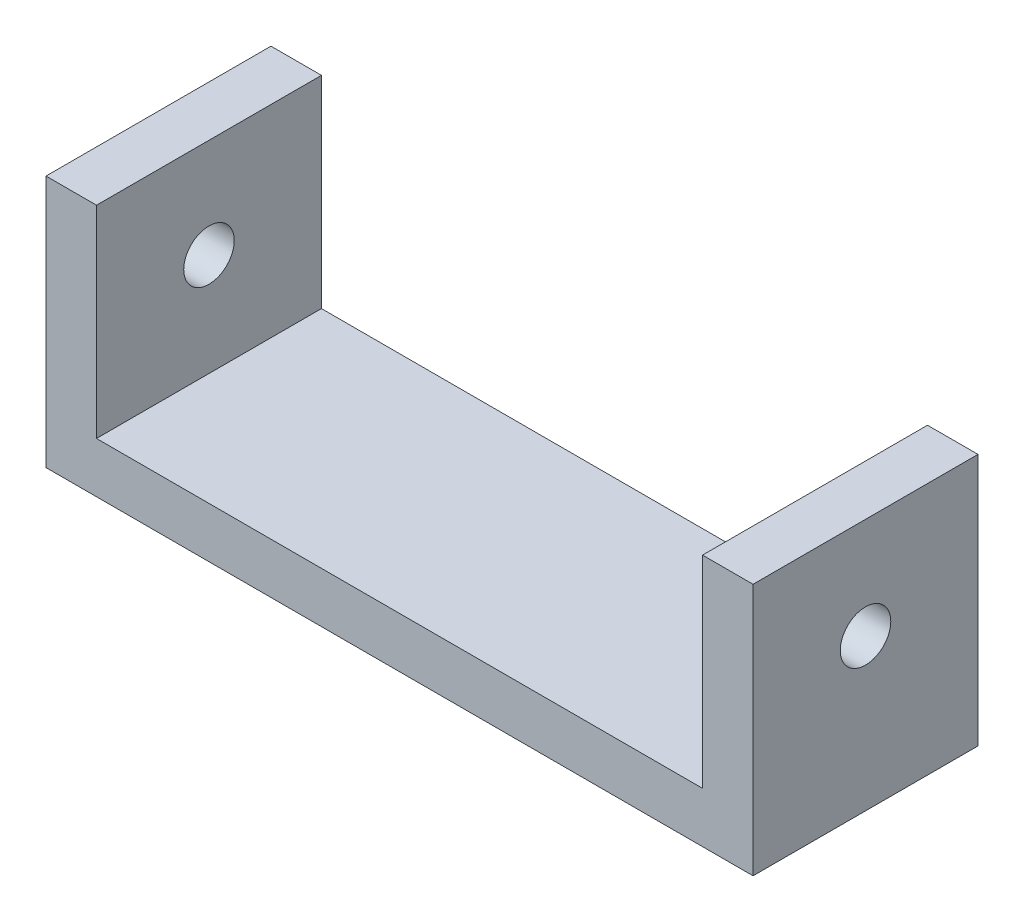
ISO-10303-21;
HEADER;
FILE_DESCRIPTION(('STEP AP214'),'2;1');
FILE_NAME('part.step','',(''),(''),'','','');
FILE_SCHEMA(('AUTOMOTIVE_DESIGN { 1 0 10303 214 1 1 1 1 }'));
ENDSEC;
DATA;
#1=APPLICATION_CONTEXT('core data for automotive mechanical design processes');
#2=APPLICATION_PROTOCOL_DEFINITION('international standard','automotive_design',2000,#1);
#3=PRODUCT_CONTEXT('',#1,'mechanical');
#4=PRODUCT('Part','Part','',(#3));
#5=PRODUCT_RELATED_PRODUCT_CATEGORY('part','',(#4));
#6=PRODUCT_DEFINITION_FORMATION('','',#4);
#7=PRODUCT_DEFINITION_CONTEXT('part definition',#1,'design');
#8=PRODUCT_DEFINITION('design','',#6,#7);
#9=PRODUCT_DEFINITION_SHAPE('','',#8);
#10=(LENGTH_UNIT() NAMED_UNIT(*) SI_UNIT(.MILLI.,.METRE.));
#11=(NAMED_UNIT(*) PLANE_ANGLE_UNIT() SI_UNIT($,.RADIAN.));
#12=(NAMED_UNIT(*) SI_UNIT($,.STERADIAN.) SOLID_ANGLE_UNIT());
#13=UNCERTAINTY_MEASURE_WITH_UNIT(LENGTH_MEASURE(1.E-05),#10,'distance_accuracy_value','');
#14=(GEOMETRIC_REPRESENTATION_CONTEXT(3) GLOBAL_UNCERTAINTY_ASSIGNED_CONTEXT((#13)) GLOBAL_UNIT_ASSIGNED_CONTEXT((#10,
#11,#12)) REPRESENTATION_CONTEXT('',''));
#15=CARTESIAN_POINT('',(0.,0.,0.));
#16=DIRECTION('',(0.,0.,1.));
#17=DIRECTION('',(1.,0.,0.));
#18=AXIS2_PLACEMENT_3D('',#15,#16,#17);
#19=CARTESIAN_POINT('',(0.,6.35,0.));
#20=DIRECTION('',(0.,1.,0.));
#21=DIRECTION('',(0.,0.,1.));
#22=AXIS2_PLACEMENT_3D('',#19,#20,#21);
#23=PLANE('',#22);
#24=DIRECTION('',(1.,0.,0.));
#25=VECTOR('',#24,1.);
#26=CARTESIAN_POINT('',(-44.45,6.35,14.1421245421245));
#27=LINE('',#26,#25);
#28=CARTESIAN_POINT('',(-38.1,6.35,14.1421245421245));
#29=VERTEX_POINT('',#28);
#30=CARTESIAN_POINT('',(38.1,6.35,14.1421245421245));
#31=VERTEX_POINT('',#30);
#32=EDGE_CURVE('E61',#29,#31,#27,.T.);
#33=ORIENTED_EDGE('',*,*,#32,.T.);
#34=DIRECTION('',(0.,0.,1.));
#35=VECTOR('',#34,1.);
#36=CARTESIAN_POINT('',(38.1,6.35,-14.1421245421245));
#37=LINE('',#36,#35);
#38=CARTESIAN_POINT('',(38.1,6.35,-14.1421245421245));
#39=VERTEX_POINT('',#38);
#40=EDGE_CURVE('E56',#39,#31,#37,.T.);
#41=ORIENTED_EDGE('',*,*,#40,.F.);
#42=DIRECTION('',(-1.,0.,0.));
#43=VECTOR('',#42,1.);
#44=CARTESIAN_POINT('',(-44.45,6.35,-14.1421245421245));
#45=LINE('',#44,#43);
#46=CARTESIAN_POINT('',(-38.1,6.35,-14.1421245421245));
#47=VERTEX_POINT('',#46);
#48=EDGE_CURVE('E170',#39,#47,#45,.T.);
#49=ORIENTED_EDGE('',*,*,#48,.T.);
#50=DIRECTION('',(0.,0.,-1.));
#51=VECTOR('',#50,1.);
#52=CARTESIAN_POINT('',(-38.1,6.35,-14.1421245421245));
#53=LINE('',#52,#51);
#54=EDGE_CURVE('E144',#29,#47,#53,.T.);
#55=ORIENTED_EDGE('',*,*,#54,.F.);
#56=EDGE_LOOP('',(#33,#41,#49,#55));
#57=FACE_BOUND('',#56,.T.);
#58=ADVANCED_FACE('F39',(#57),#23,.T.);
#59=CARTESIAN_POINT('',(44.45,6.35,-14.1421245421245));
#60=DIRECTION('',(-1.,0.,0.));
#61=DIRECTION('',(0.,0.,1.));
#62=AXIS2_PLACEMENT_3D('',#59,#60,#61);
#63=PLANE('',#62);
#64=CARTESIAN_POINT('',(44.45,19.05,0.));
#65=DIRECTION('',(1.,0.,0.));
#66=DIRECTION('',(0.,0.,-1.));
#67=AXIS2_PLACEMENT_3D('',#64,#65,#66);
#68=CIRCLE('',#67,3.175);
#69=CARTESIAN_POINT('',(44.45,19.05,-3.175));
#70=VERTEX_POINT('',#69);
#71=EDGE_CURVE('E340',#70,#70,#68,.T.);
#72=ORIENTED_EDGE('',*,*,#71,.F.);
#73=EDGE_LOOP('',(#72));
#74=FACE_BOUND('',#73,.T.);
#75=DIRECTION('',(0.,0.,-1.));
#76=VECTOR('',#75,1.);
#77=CARTESIAN_POINT('',(44.45,0.,-14.1421245421245));
#78=LINE('',#77,#76);
#79=CARTESIAN_POINT('',(44.45,0.,14.1421245421245));
#80=VERTEX_POINT('',#79);
#81=CARTESIAN_POINT('',(44.45,0.,-14.1421245421245));
#82=VERTEX_POINT('',#81);
#83=EDGE_CURVE('E109',#80,#82,#78,.T.);
#84=ORIENTED_EDGE('',*,*,#83,.T.);
#85=DIRECTION('',(0.,-1.,0.));
#86=VECTOR('',#85,1.);
#87=CARTESIAN_POINT('',(44.45,6.35,-14.1421245421245));
#88=LINE('',#87,#86);
#89=CARTESIAN_POINT('',(44.45,31.75,-14.1421245421245));
#90=VERTEX_POINT('',#89);
#91=EDGE_CURVE('E11',#90,#82,#88,.T.);
#92=ORIENTED_EDGE('',*,*,#91,.F.);
#93=DIRECTION('',(0.,0.,-1.));
#94=VECTOR('',#93,1.);
#95=CARTESIAN_POINT('',(44.45,31.75,-14.1421245421245));
#96=LINE('',#95,#94);
#97=CARTESIAN_POINT('',(44.45,31.75,14.1421245421245));
#98=VERTEX_POINT('',#97);
#99=EDGE_CURVE('E107',#98,#90,#96,.T.);
#100=ORIENTED_EDGE('',*,*,#99,.F.);
#101=DIRECTION('',(0.,-1.,0.));
#102=VECTOR('',#101,1.);
#103=CARTESIAN_POINT('',(44.45,6.35,14.1421245421245));
#104=LINE('',#103,#102);
#105=EDGE_CURVE('E176',#98,#80,#104,.T.);
#106=ORIENTED_EDGE('',*,*,#105,.T.);
#107=EDGE_LOOP('',(#84,#92,#100,#106));
#108=FACE_BOUND('',#107,.T.);
#109=ADVANCED_FACE('F41',(#74,#108),#63,.F.);
#110=CARTESIAN_POINT('',(-44.45,6.35,-14.1421245421245));
#111=DIRECTION('',(0.,0.,1.));
#112=DIRECTION('',(1.,0.,0.));
#113=AXIS2_PLACEMENT_3D('',#110,#111,#112);
#114=PLANE('',#113);
#115=DIRECTION('',(-1.,0.,0.));
#116=VECTOR('',#115,1.);
#117=CARTESIAN_POINT('',(-44.45,0.,-14.1421245421245));
#118=LINE('',#117,#116);
#119=CARTESIAN_POINT('',(-44.45,0.,-14.1421245421245));
#120=VERTEX_POINT('',#119);
#121=EDGE_CURVE('E179',#82,#120,#118,.T.);
#122=ORIENTED_EDGE('',*,*,#121,.T.);
#123=DIRECTION('',(0.,-1.,0.));
#124=VECTOR('',#123,1.);
#125=CARTESIAN_POINT('',(-44.45,6.35,-14.1421245421245));
#126=LINE('',#125,#124);
#127=CARTESIAN_POINT('',(-44.45,31.75,-14.1421245421245));
#128=VERTEX_POINT('',#127);
#129=EDGE_CURVE('E49',#128,#120,#126,.T.);
#130=ORIENTED_EDGE('',*,*,#129,.F.);
#131=DIRECTION('',(-1.,0.,0.));
#132=VECTOR('',#131,1.);
#133=CARTESIAN_POINT('',(-44.45,31.75,-14.1421245421245));
#134=LINE('',#133,#132);
#135=CARTESIAN_POINT('',(-38.1,31.75,-14.1421245421245));
#136=VERTEX_POINT('',#135);
#137=EDGE_CURVE('E155',#136,#128,#134,.T.);
#138=ORIENTED_EDGE('',*,*,#137,.F.);
#139=DIRECTION('',(0.,-1.,0.));
#140=VECTOR('',#139,1.);
#141=CARTESIAN_POINT('',(-38.1,31.75,-14.1421245421245));
#142=LINE('',#141,#140);
#143=EDGE_CURVE('E159',#136,#47,#142,.T.);
#144=ORIENTED_EDGE('',*,*,#143,.T.);
#145=ORIENTED_EDGE('',*,*,#48,.F.);
#146=DIRECTION('',(0.,-1.,0.));
#147=VECTOR('',#146,1.);
#148=CARTESIAN_POINT('',(38.1,31.75,-14.1421245421245));
#149=LINE('',#148,#147);
#150=CARTESIAN_POINT('',(38.1,31.75,-14.1421245421245));
#151=VERTEX_POINT('',#150);
#152=EDGE_CURVE('E115',#151,#39,#149,.T.);
#153=ORIENTED_EDGE('',*,*,#152,.F.);
#154=DIRECTION('',(-1.,0.,0.));
#155=VECTOR('',#154,1.);
#156=CARTESIAN_POINT('',(44.45,31.75,-14.1421245421245));
#157=LINE('',#156,#155);
#158=EDGE_CURVE('E112',#90,#151,#157,.T.);
#159=ORIENTED_EDGE('',*,*,#158,.F.);
#160=ORIENTED_EDGE('',*,*,#91,.T.);
#161=EDGE_LOOP('',(#122,#130,#138,#144,#145,#153,#159,#160));
#162=FACE_BOUND('',#161,.T.);
#163=ADVANCED_FACE('F113',(#162),#114,.F.);
#164=CARTESIAN_POINT('',(-44.45,6.35,-14.1421245421245));
#165=DIRECTION('',(1.,0.,0.));
#166=DIRECTION('',(0.,0.,-1.));
#167=AXIS2_PLACEMENT_3D('',#164,#165,#166);
#168=PLANE('',#167);
#169=CARTESIAN_POINT('',(-44.45,19.2479158123226,0.));
#170=DIRECTION('',(-1.,0.,0.));
#171=DIRECTION('',(0.,0.,1.));
#172=AXIS2_PLACEMENT_3D('',#169,#170,#171);
#173=CIRCLE('',#172,3.175);
#174=CARTESIAN_POINT('',(-44.45,19.2479158123226,3.175));
#175=VERTEX_POINT('',#174);
#176=EDGE_CURVE('E131',#175,#175,#173,.T.);
#177=ORIENTED_EDGE('',*,*,#176,.F.);
#178=EDGE_LOOP('',(#177));
#179=FACE_BOUND('',#178,.T.);
#180=DIRECTION('',(0.,0.,1.));
#181=VECTOR('',#180,1.);
#182=CARTESIAN_POINT('',(-44.45,0.,-14.1421245421245));
#183=LINE('',#182,#181);
#184=CARTESIAN_POINT('',(-44.45,0.,14.1421245421245));
#185=VERTEX_POINT('',#184);
#186=EDGE_CURVE('E182',#120,#185,#183,.T.);
#187=ORIENTED_EDGE('',*,*,#186,.T.);
#188=DIRECTION('',(0.,-1.,0.));
#189=VECTOR('',#188,1.);
#190=CARTESIAN_POINT('',(-44.45,6.35,14.1421245421245));
#191=LINE('',#190,#189);
#192=CARTESIAN_POINT('',(-44.45,31.75,14.1421245421245));
#193=VERTEX_POINT('',#192);
#194=EDGE_CURVE('E189',#193,#185,#191,.T.);
#195=ORIENTED_EDGE('',*,*,#194,.F.);
#196=DIRECTION('',(0.,0.,1.));
#197=VECTOR('',#196,1.);
#198=CARTESIAN_POINT('',(-44.45,31.75,-14.1421245421245));
#199=LINE('',#198,#197);
#200=EDGE_CURVE('E145',#128,#193,#199,.T.);
#201=ORIENTED_EDGE('',*,*,#200,.F.);
#202=ORIENTED_EDGE('',*,*,#129,.T.);
#203=EDGE_LOOP('',(#187,#195,#201,#202));
#204=FACE_BOUND('',#203,.T.);
#205=ADVANCED_FACE('F198',(#179,#204),#168,.F.);
#206=CARTESIAN_POINT('',(-44.45,6.35,14.1421245421245));
#207=DIRECTION('',(0.,0.,-1.));
#208=DIRECTION('',(-1.,0.,0.));
#209=AXIS2_PLACEMENT_3D('',#206,#207,#208);
#210=PLANE('',#209);
#211=DIRECTION('',(1.,0.,0.));
#212=VECTOR('',#211,1.);
#213=CARTESIAN_POINT('',(-44.45,0.,14.1421245421245));
#214=LINE('',#213,#212);
#215=EDGE_CURVE('E173',#185,#80,#214,.T.);
#216=ORIENTED_EDGE('',*,*,#215,.T.);
#217=ORIENTED_EDGE('',*,*,#105,.F.);
#218=DIRECTION('',(1.,0.,0.));
#219=VECTOR('',#218,1.);
#220=CARTESIAN_POINT('',(44.45,31.75,14.1421245421245));
#221=LINE('',#220,#219);
#222=CARTESIAN_POINT('',(38.1,31.75,14.1421245421245));
#223=VERTEX_POINT('',#222);
#224=EDGE_CURVE('E124',#223,#98,#221,.T.);
#225=ORIENTED_EDGE('',*,*,#224,.F.);
#226=DIRECTION('',(0.,-1.,0.));
#227=VECTOR('',#226,1.);
#228=CARTESIAN_POINT('',(38.1,31.75,14.1421245421245));
#229=LINE('',#228,#227);
#230=EDGE_CURVE('E137',#223,#31,#229,.T.);
#231=ORIENTED_EDGE('',*,*,#230,.T.);
#232=ORIENTED_EDGE('',*,*,#32,.F.);
#233=DIRECTION('',(0.,-1.,0.));
#234=VECTOR('',#233,1.);
#235=CARTESIAN_POINT('',(-38.1,31.75,14.1421245421245));
#236=LINE('',#235,#234);
#237=CARTESIAN_POINT('',(-38.1,31.75,14.1421245421245));
#238=VERTEX_POINT('',#237);
#239=EDGE_CURVE('E166',#238,#29,#236,.T.);
#240=ORIENTED_EDGE('',*,*,#239,.F.);
#241=DIRECTION('',(1.,0.,0.));
#242=VECTOR('',#241,1.);
#243=CARTESIAN_POINT('',(-44.45,31.75,14.1421245421245));
#244=LINE('',#243,#242);
#245=EDGE_CURVE('E149',#193,#238,#244,.T.);
#246=ORIENTED_EDGE('',*,*,#245,.F.);
#247=ORIENTED_EDGE('',*,*,#194,.T.);
#248=EDGE_LOOP('',(#216,#217,#225,#231,#232,#240,#246,#247));
#249=FACE_BOUND('',#248,.T.);
#250=ADVANCED_FACE('F204',(#249),#210,.F.);
#251=CARTESIAN_POINT('',(0.,0.,0.));
#252=DIRECTION('',(0.,1.,0.));
#253=DIRECTION('',(0.,0.,1.));
#254=AXIS2_PLACEMENT_3D('',#251,#252,#253);
#255=PLANE('',#254);
#256=ORIENTED_EDGE('',*,*,#83,.F.);
#257=ORIENTED_EDGE('',*,*,#215,.F.);
#258=ORIENTED_EDGE('',*,*,#186,.F.);
#259=ORIENTED_EDGE('',*,*,#121,.F.);
#260=EDGE_LOOP('',(#256,#257,#258,#259));
#261=FACE_BOUND('',#260,.T.);
#262=ADVANCED_FACE('F202',(#261),#255,.F.);
#263=CARTESIAN_POINT('',(-38.1,31.75,-14.1421245421245));
#264=DIRECTION('',(-1.,0.,0.));
#265=DIRECTION('',(0.,0.,1.));
#266=AXIS2_PLACEMENT_3D('',#263,#264,#265);
#267=PLANE('',#266);
#268=CARTESIAN_POINT('',(-38.1,19.2479158123226,0.));
#269=DIRECTION('',(-1.,0.,0.));
#270=DIRECTION('',(0.,0.,1.));
#271=AXIS2_PLACEMENT_3D('',#268,#269,#270);
#272=CIRCLE('',#271,3.175);
#273=CARTESIAN_POINT('',(-38.1,19.2479158123226,3.175));
#274=VERTEX_POINT('',#273);
#275=EDGE_CURVE('E128',#274,#274,#272,.T.);
#276=ORIENTED_EDGE('',*,*,#275,.T.);
#277=EDGE_LOOP('',(#276));
#278=FACE_BOUND('',#277,.T.);
#279=ORIENTED_EDGE('',*,*,#54,.T.);
#280=ORIENTED_EDGE('',*,*,#143,.F.);
#281=DIRECTION('',(0.,0.,-1.));
#282=VECTOR('',#281,1.);
#283=CARTESIAN_POINT('',(-38.1,31.75,-14.1421245421245));
#284=LINE('',#283,#282);
#285=EDGE_CURVE('E152',#238,#136,#284,.T.);
#286=ORIENTED_EDGE('',*,*,#285,.F.);
#287=ORIENTED_EDGE('',*,*,#239,.T.);
#288=EDGE_LOOP('',(#279,#280,#286,#287));
#289=FACE_BOUND('',#288,.T.);
#290=ADVANCED_FACE('F212',(#278,#289),#267,.F.);
#291=CARTESIAN_POINT('',(0.,31.75,0.));
#292=DIRECTION('',(0.,1.,0.));
#293=DIRECTION('',(0.,0.,1.));
#294=AXIS2_PLACEMENT_3D('',#291,#292,#293);
#295=PLANE('',#294);
#296=ORIENTED_EDGE('',*,*,#200,.T.);
#297=ORIENTED_EDGE('',*,*,#245,.T.);
#298=ORIENTED_EDGE('',*,*,#285,.T.);
#299=ORIENTED_EDGE('',*,*,#137,.T.);
#300=EDGE_LOOP('',(#296,#297,#298,#299));
#301=FACE_BOUND('',#300,.T.);
#302=ADVANCED_FACE('F209',(#301),#295,.T.);
#303=CARTESIAN_POINT('',(38.1,31.75,-14.1421245421245));
#304=DIRECTION('',(1.,0.,0.));
#305=DIRECTION('',(0.,0.,-1.));
#306=AXIS2_PLACEMENT_3D('',#303,#304,#305);
#307=PLANE('',#306);
#308=CARTESIAN_POINT('',(38.1,19.05,0.));
#309=DIRECTION('',(1.,0.,0.));
#310=DIRECTION('',(0.,0.,-1.));
#311=AXIS2_PLACEMENT_3D('',#308,#309,#310);
#312=CIRCLE('',#311,3.175);
#313=CARTESIAN_POINT('',(38.1,19.05,-3.175));
#314=VERTEX_POINT('',#313);
#315=EDGE_CURVE('E43',#314,#314,#312,.T.);
#316=ORIENTED_EDGE('',*,*,#315,.T.);
#317=EDGE_LOOP('',(#316));
#318=FACE_BOUND('',#317,.T.);
#319=ORIENTED_EDGE('',*,*,#40,.T.);
#320=ORIENTED_EDGE('',*,*,#230,.F.);
#321=DIRECTION('',(0.,0.,1.));
#322=VECTOR('',#321,1.);
#323=CARTESIAN_POINT('',(38.1,31.75,-14.1421245421245));
#324=LINE('',#323,#322);
#325=EDGE_CURVE('E119',#151,#223,#324,.T.);
#326=ORIENTED_EDGE('',*,*,#325,.F.);
#327=ORIENTED_EDGE('',*,*,#152,.T.);
#328=EDGE_LOOP('',(#319,#320,#326,#327));
#329=FACE_BOUND('',#328,.T.);
#330=ADVANCED_FACE('F215',(#318,#329),#307,.F.);
#331=CARTESIAN_POINT('',(0.,31.75,0.));
#332=DIRECTION('',(0.,-1.,0.));
#333=DIRECTION('',(0.,0.,-1.));
#334=AXIS2_PLACEMENT_3D('',#331,#332,#333);
#335=PLANE('',#334);
#336=ORIENTED_EDGE('',*,*,#99,.T.);
#337=ORIENTED_EDGE('',*,*,#158,.T.);
#338=ORIENTED_EDGE('',*,*,#325,.T.);
#339=ORIENTED_EDGE('',*,*,#224,.T.);
#340=EDGE_LOOP('',(#336,#337,#338,#339));
#341=FACE_BOUND('',#340,.T.);
#342=ADVANCED_FACE('F122',(#341),#335,.F.);
#343=CARTESIAN_POINT('',(-38.1,19.2479158123226,0.));
#344=DIRECTION('',(-1.,0.,0.));
#345=DIRECTION('',(0.,0.,1.));
#346=AXIS2_PLACEMENT_3D('',#343,#344,#345);
#347=CYLINDRICAL_SURFACE('',#346,3.175);
#348=ORIENTED_EDGE('',*,*,#275,.F.);
#349=EDGE_LOOP('',(#348));
#350=FACE_BOUND('',#349,.T.);
#351=ORIENTED_EDGE('',*,*,#176,.T.);
#352=EDGE_LOOP('',(#351));
#353=FACE_BOUND('',#352,.T.);
#354=ADVANCED_FACE('F223',(#350,#353),#347,.F.);
#355=CARTESIAN_POINT('',(36.83,19.05,0.));
#356=DIRECTION('',(1.,0.,0.));
#357=DIRECTION('',(0.,0.,-1.));
#358=AXIS2_PLACEMENT_3D('',#355,#356,#357);
#359=CYLINDRICAL_SURFACE('',#358,3.175);
#360=ORIENTED_EDGE('',*,*,#71,.T.);
#361=EDGE_LOOP('',(#360));
#362=FACE_BOUND('',#361,.T.);
#363=ORIENTED_EDGE('',*,*,#315,.F.);
#364=EDGE_LOOP('',(#363));
#365=FACE_BOUND('',#364,.T.);
#366=ADVANCED_FACE('F284',(#362,#365),#359,.F.);
#367=CLOSED_SHELL('',(#58,#109,#163,#205,#250,#262,#290,#302,#330,#342,#354,#366));
#368=MANIFOLD_SOLID_BREP('B2',#367);
#369=ADVANCED_BREP_SHAPE_REPRESENTATION('',(#18,#368),#14);
#370=SHAPE_DEFINITION_REPRESENTATION(#9,#369);
ENDSEC;
END-ISO-10303-21;
